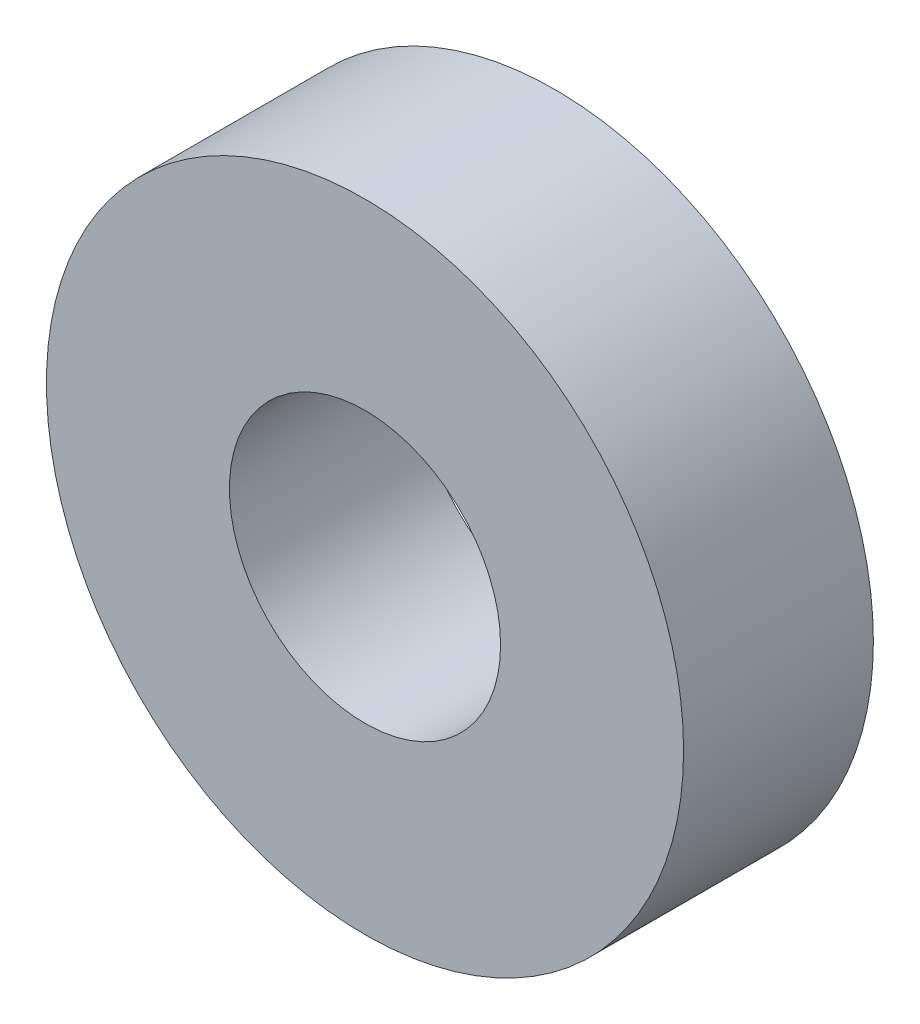
ISO-10303-21;
HEADER;
FILE_DESCRIPTION(('STEP AP214'),'2;1');
FILE_NAME('part.step','',(''),(''),'','','');
FILE_SCHEMA(('AUTOMOTIVE_DESIGN { 1 0 10303 214 1 1 1 1 }'));
ENDSEC;
DATA;
#1=APPLICATION_CONTEXT('core data for automotive mechanical design processes');
#2=APPLICATION_PROTOCOL_DEFINITION('international standard','automotive_design',2000,#1);
#3=PRODUCT_CONTEXT('',#1,'mechanical');
#4=PRODUCT('Part','Part','',(#3));
#5=PRODUCT_RELATED_PRODUCT_CATEGORY('part','',(#4));
#6=PRODUCT_DEFINITION_FORMATION('','',#4);
#7=PRODUCT_DEFINITION_CONTEXT('part definition',#1,'design');
#8=PRODUCT_DEFINITION('design','',#6,#7);
#9=PRODUCT_DEFINITION_SHAPE('','',#8);
#10=(LENGTH_UNIT() NAMED_UNIT(*) SI_UNIT(.MILLI.,.METRE.));
#11=(NAMED_UNIT(*) PLANE_ANGLE_UNIT() SI_UNIT($,.RADIAN.));
#12=(NAMED_UNIT(*) SI_UNIT($,.STERADIAN.) SOLID_ANGLE_UNIT());
#13=UNCERTAINTY_MEASURE_WITH_UNIT(LENGTH_MEASURE(1.E-05),#10,'distance_accuracy_value','');
#14=(GEOMETRIC_REPRESENTATION_CONTEXT(3) GLOBAL_UNCERTAINTY_ASSIGNED_CONTEXT((#13)) GLOBAL_UNIT_ASSIGNED_CONTEXT((#10,
#11,#12)) REPRESENTATION_CONTEXT('',''));
#15=CARTESIAN_POINT('',(0.,0.,0.));
#16=DIRECTION('',(0.,0.,1.));
#17=DIRECTION('',(1.,0.,0.));
#18=AXIS2_PLACEMENT_3D('',#15,#16,#17);
#19=CARTESIAN_POINT('',(0.,0.,-26.));
#20=DIRECTION('',(0.,0.,1.));
#21=DIRECTION('',(1.,0.,0.));
#22=AXIS2_PLACEMENT_3D('',#19,#20,#21);
#23=PLANE('',#22);
#24=CARTESIAN_POINT('',(0.,0.,-26.));
#25=DIRECTION('',(0.,0.,1.));
#26=DIRECTION('',(1.,0.,0.));
#27=AXIS2_PLACEMENT_3D('',#24,#25,#26);
#28=CIRCLE('',#27,23.5);
#29=CARTESIAN_POINT('',(23.5,0.,-26.));
#30=VERTEX_POINT('',#29);
#31=EDGE_CURVE('E10',#30,#30,#28,.T.);
#32=ORIENTED_EDGE('',*,*,#31,.T.);
#33=EDGE_LOOP('',(#32));
#34=FACE_BOUND('',#33,.T.);
#35=CARTESIAN_POINT('',(0.,0.,-26.));
#36=DIRECTION('',(0.,0.,1.));
#37=DIRECTION('',(1.,0.,0.));
#38=AXIS2_PLACEMENT_3D('',#35,#36,#37);
#39=CIRCLE('',#38,10.);
#40=CARTESIAN_POINT('',(10.,0.,-26.));
#41=VERTEX_POINT('',#40);
#42=EDGE_CURVE('E46',#41,#41,#39,.T.);
#43=ORIENTED_EDGE('',*,*,#42,.F.);
#44=EDGE_LOOP('',(#43));
#45=FACE_BOUND('',#44,.T.);
#46=ADVANCED_FACE('F35',(#34,#45),#23,.T.);
#47=CARTESIAN_POINT('',(0.,0.,-40.));
#48=DIRECTION('',(0.,0.,1.));
#49=DIRECTION('',(1.,0.,0.));
#50=AXIS2_PLACEMENT_3D('',#47,#48,#49);
#51=PLANE('',#50);
#52=CARTESIAN_POINT('',(0.,0.,-40.));
#53=DIRECTION('',(0.,0.,1.));
#54=DIRECTION('',(1.,0.,0.));
#55=AXIS2_PLACEMENT_3D('',#52,#53,#54);
#56=CIRCLE('',#55,23.5);
#57=CARTESIAN_POINT('',(23.5,0.,-40.));
#58=VERTEX_POINT('',#57);
#59=EDGE_CURVE('E39',#58,#58,#56,.T.);
#60=ORIENTED_EDGE('',*,*,#59,.F.);
#61=EDGE_LOOP('',(#60));
#62=FACE_BOUND('',#61,.T.);
#63=CARTESIAN_POINT('',(0.,0.,-40.));
#64=DIRECTION('',(0.,0.,1.));
#65=DIRECTION('',(1.,0.,0.));
#66=AXIS2_PLACEMENT_3D('',#63,#64,#65);
#67=CIRCLE('',#66,10.);
#68=CARTESIAN_POINT('',(10.,0.,-40.));
#69=VERTEX_POINT('',#68);
#70=EDGE_CURVE('E48',#69,#69,#67,.T.);
#71=ORIENTED_EDGE('',*,*,#70,.T.);
#72=EDGE_LOOP('',(#71));
#73=FACE_BOUND('',#72,.T.);
#74=ADVANCED_FACE('F58',(#62,#73),#51,.F.);
#75=CARTESIAN_POINT('',(0.,0.,-26.));
#76=DIRECTION('',(0.,0.,-1.));
#77=DIRECTION('',(-1.,0.,0.));
#78=AXIS2_PLACEMENT_3D('',#75,#76,#77);
#79=CYLINDRICAL_SURFACE('',#78,23.5);
#80=ORIENTED_EDGE('',*,*,#31,.F.);
#81=EDGE_LOOP('',(#80));
#82=FACE_BOUND('',#81,.T.);
#83=ORIENTED_EDGE('',*,*,#59,.T.);
#84=EDGE_LOOP('',(#83));
#85=FACE_BOUND('',#84,.T.);
#86=ADVANCED_FACE('F37',(#82,#85),#79,.T.);
#87=CARTESIAN_POINT('',(0.,0.,-26.));
#88=DIRECTION('',(0.,0.,-1.));
#89=DIRECTION('',(-1.,0.,0.));
#90=AXIS2_PLACEMENT_3D('',#87,#88,#89);
#91=CYLINDRICAL_SURFACE('',#90,10.);
#92=ORIENTED_EDGE('',*,*,#42,.T.);
#93=EDGE_LOOP('',(#92));
#94=FACE_BOUND('',#93,.T.);
#95=ORIENTED_EDGE('',*,*,#70,.F.);
#96=EDGE_LOOP('',(#95));
#97=FACE_BOUND('',#96,.T.);
#98=ADVANCED_FACE('F54',(#94,#97),#91,.F.);
#99=CLOSED_SHELL('',(#46,#74,#86,#98));
#100=MANIFOLD_SOLID_BREP('B2',#99);
#101=ADVANCED_BREP_SHAPE_REPRESENTATION('',(#18,#100),#14);
#102=SHAPE_DEFINITION_REPRESENTATION(#9,#101);
ENDSEC;
END-ISO-10303-21;
